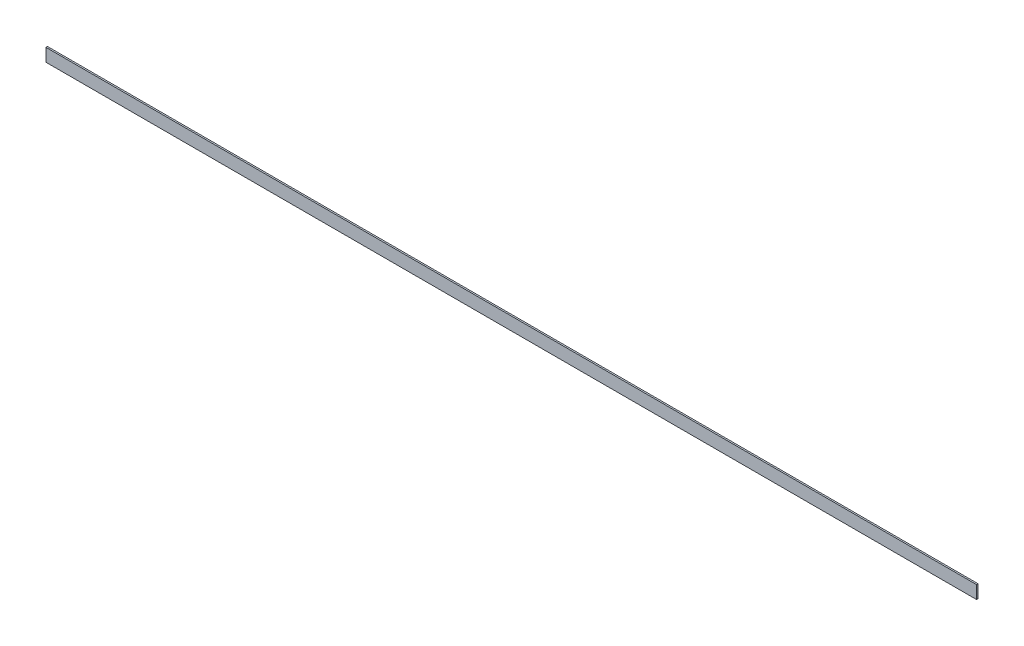
ISO-10303-21;
HEADER;
FILE_DESCRIPTION(('STEP AP214'),'2;1');
FILE_NAME('part.step','',(''),(''),'','','');
FILE_SCHEMA(('AUTOMOTIVE_DESIGN { 1 0 10303 214 1 1 1 1 }'));
ENDSEC;
DATA;
#1=APPLICATION_CONTEXT('core data for automotive mechanical design processes');
#2=APPLICATION_PROTOCOL_DEFINITION('international standard','automotive_design',2000,#1);
#3=PRODUCT_CONTEXT('',#1,'mechanical');
#4=PRODUCT('Part','Part','',(#3));
#5=PRODUCT_RELATED_PRODUCT_CATEGORY('part','',(#4));
#6=PRODUCT_DEFINITION_FORMATION('','',#4);
#7=PRODUCT_DEFINITION_CONTEXT('part definition',#1,'design');
#8=PRODUCT_DEFINITION('design','',#6,#7);
#9=PRODUCT_DEFINITION_SHAPE('','',#8);
#10=(LENGTH_UNIT() NAMED_UNIT(*) SI_UNIT(.MILLI.,.METRE.));
#11=(NAMED_UNIT(*) PLANE_ANGLE_UNIT() SI_UNIT($,.RADIAN.));
#12=(NAMED_UNIT(*) SI_UNIT($,.STERADIAN.) SOLID_ANGLE_UNIT());
#13=UNCERTAINTY_MEASURE_WITH_UNIT(LENGTH_MEASURE(1.E-05),#10,'distance_accuracy_value','');
#14=(GEOMETRIC_REPRESENTATION_CONTEXT(3) GLOBAL_UNCERTAINTY_ASSIGNED_CONTEXT((#13)) GLOBAL_UNIT_ASSIGNED_CONTEXT((#10,
#11,#12)) REPRESENTATION_CONTEXT('',''));
#15=CARTESIAN_POINT('',(0.,0.,0.));
#16=DIRECTION('',(0.,0.,1.));
#17=DIRECTION('',(1.,0.,0.));
#18=AXIS2_PLACEMENT_3D('',#15,#16,#17);
#19=CARTESIAN_POINT('',(-499.103870658318,236.482117486868,1.5875));
#20=DIRECTION('',(1.,0.,0.));
#21=DIRECTION('',(0.,1.,0.));
#22=AXIS2_PLACEMENT_3D('',#19,#20,#21);
#23=PLANE('',#22);
#24=DIRECTION('',(0.,-1.,0.));
#25=VECTOR('',#24,1.);
#26=CARTESIAN_POINT('',(-499.103870658318,236.482117486868,0.));
#27=LINE('',#26,#25);
#28=CARTESIAN_POINT('',(-499.103870658318,236.482117486868,0.));
#29=VERTEX_POINT('',#28);
#30=CARTESIAN_POINT('',(-499.103870658318,222.982117486868,0.));
#31=VERTEX_POINT('',#30);
#32=EDGE_CURVE('E107',#29,#31,#27,.T.);
#33=ORIENTED_EDGE('',*,*,#32,.T.);
#34=DIRECTION('',(0.,0.,-1.));
#35=VECTOR('',#34,1.);
#36=CARTESIAN_POINT('',(-499.103870658318,222.982117486868,1.5875));
#37=LINE('',#36,#35);
#38=CARTESIAN_POINT('',(-499.103870658318,222.982117486868,1.5875));
#39=VERTEX_POINT('',#38);
#40=EDGE_CURVE('E11',#39,#31,#37,.T.);
#41=ORIENTED_EDGE('',*,*,#40,.F.);
#42=DIRECTION('',(0.,-1.,0.));
#43=VECTOR('',#42,1.);
#44=CARTESIAN_POINT('',(-499.103870658318,236.482117486868,1.5875));
#45=LINE('',#44,#43);
#46=CARTESIAN_POINT('',(-499.103870658318,236.482117486868,1.5875));
#47=VERTEX_POINT('',#46);
#48=EDGE_CURVE('E91',#47,#39,#45,.T.);
#49=ORIENTED_EDGE('',*,*,#48,.F.);
#50=DIRECTION('',(0.,0.,-1.));
#51=VECTOR('',#50,1.);
#52=CARTESIAN_POINT('',(-499.103870658318,236.482117486868,1.5875));
#53=LINE('',#52,#51);
#54=EDGE_CURVE('E103',#47,#29,#53,.T.);
#55=ORIENTED_EDGE('',*,*,#54,.T.);
#56=EDGE_LOOP('',(#33,#41,#49,#55));
#57=FACE_BOUND('',#56,.T.);
#58=ADVANCED_FACE('F39',(#57),#23,.F.);
#59=CARTESIAN_POINT('',(-499.103870658318,222.982117486868,1.5875));
#60=DIRECTION('',(0.,1.,0.));
#61=DIRECTION('',(0.,0.,1.));
#62=AXIS2_PLACEMENT_3D('',#59,#60,#61);
#63=PLANE('',#62);
#64=DIRECTION('',(1.,0.,0.));
#65=VECTOR('',#64,1.);
#66=CARTESIAN_POINT('',(-499.103870658318,222.982117486868,0.));
#67=LINE('',#66,#65);
#68=CARTESIAN_POINT('',(471.948037991682,222.982117486868,0.));
#69=VERTEX_POINT('',#68);
#70=EDGE_CURVE('E96',#31,#69,#67,.T.);
#71=ORIENTED_EDGE('',*,*,#70,.T.);
#72=DIRECTION('',(0.,0.,-1.));
#73=VECTOR('',#72,1.);
#74=CARTESIAN_POINT('',(471.948037991682,222.982117486868,1.5875));
#75=LINE('',#74,#73);
#76=CARTESIAN_POINT('',(471.948037991682,222.982117486868,1.5875));
#77=VERTEX_POINT('',#76);
#78=EDGE_CURVE('E48',#77,#69,#75,.T.);
#79=ORIENTED_EDGE('',*,*,#78,.F.);
#80=DIRECTION('',(1.,0.,0.));
#81=VECTOR('',#80,1.);
#82=CARTESIAN_POINT('',(-499.103870658318,222.982117486868,1.5875));
#83=LINE('',#82,#81);
#84=EDGE_CURVE('E86',#39,#77,#83,.T.);
#85=ORIENTED_EDGE('',*,*,#84,.F.);
#86=ORIENTED_EDGE('',*,*,#40,.T.);
#87=EDGE_LOOP('',(#71,#79,#85,#86));
#88=FACE_BOUND('',#87,.T.);
#89=ADVANCED_FACE('F95',(#88),#63,.F.);
#90=CARTESIAN_POINT('',(471.948037991682,236.482117486868,1.5875));
#91=DIRECTION('',(-1.,0.,0.));
#92=DIRECTION('',(0.,0.,1.));
#93=AXIS2_PLACEMENT_3D('',#90,#91,#92);
#94=PLANE('',#93);
#95=DIRECTION('',(0.,1.,0.));
#96=VECTOR('',#95,1.);
#97=CARTESIAN_POINT('',(471.948037991682,236.482117486868,0.));
#98=LINE('',#97,#96);
#99=CARTESIAN_POINT('',(471.948037991682,236.482117486868,0.));
#100=VERTEX_POINT('',#99);
#101=EDGE_CURVE('E73',#69,#100,#98,.T.);
#102=ORIENTED_EDGE('',*,*,#101,.T.);
#103=DIRECTION('',(0.,0.,-1.));
#104=VECTOR('',#103,1.);
#105=CARTESIAN_POINT('',(471.948037991682,236.482117486868,1.5875));
#106=LINE('',#105,#104);
#107=CARTESIAN_POINT('',(471.948037991682,236.482117486868,1.5875));
#108=VERTEX_POINT('',#107);
#109=EDGE_CURVE('E98',#108,#100,#106,.T.);
#110=ORIENTED_EDGE('',*,*,#109,.F.);
#111=DIRECTION('',(0.,1.,0.));
#112=VECTOR('',#111,1.);
#113=CARTESIAN_POINT('',(471.948037991682,236.482117486868,1.5875));
#114=LINE('',#113,#112);
#115=EDGE_CURVE('E89',#77,#108,#114,.T.);
#116=ORIENTED_EDGE('',*,*,#115,.F.);
#117=ORIENTED_EDGE('',*,*,#78,.T.);
#118=EDGE_LOOP('',(#102,#110,#116,#117));
#119=FACE_BOUND('',#118,.T.);
#120=ADVANCED_FACE('F99',(#119),#94,.F.);
#121=CARTESIAN_POINT('',(-499.103870658318,236.482117486868,1.5875));
#122=DIRECTION('',(0.,-1.,0.));
#123=DIRECTION('',(0.,0.,-1.));
#124=AXIS2_PLACEMENT_3D('',#121,#122,#123);
#125=PLANE('',#124);
#126=DIRECTION('',(-1.,0.,0.));
#127=VECTOR('',#126,1.);
#128=CARTESIAN_POINT('',(-499.103870658318,236.482117486868,0.));
#129=LINE('',#128,#127);
#130=EDGE_CURVE('E79',#100,#29,#129,.T.);
#131=ORIENTED_EDGE('',*,*,#130,.T.);
#132=ORIENTED_EDGE('',*,*,#54,.F.);
#133=DIRECTION('',(-1.,0.,0.));
#134=VECTOR('',#133,1.);
#135=CARTESIAN_POINT('',(-499.103870658318,236.482117486868,1.5875));
#136=LINE('',#135,#134);
#137=EDGE_CURVE('E56',#108,#47,#136,.T.);
#138=ORIENTED_EDGE('',*,*,#137,.F.);
#139=ORIENTED_EDGE('',*,*,#109,.T.);
#140=EDGE_LOOP('',(#131,#132,#138,#139));
#141=FACE_BOUND('',#140,.T.);
#142=ADVANCED_FACE('F120',(#141),#125,.F.);
#143=CARTESIAN_POINT('',(0.,0.,1.5875));
#144=DIRECTION('',(0.,0.,1.));
#145=DIRECTION('',(1.,0.,0.));
#146=AXIS2_PLACEMENT_3D('',#143,#144,#145);
#147=PLANE('',#146);
#148=ORIENTED_EDGE('',*,*,#48,.T.);
#149=ORIENTED_EDGE('',*,*,#84,.T.);
#150=ORIENTED_EDGE('',*,*,#115,.T.);
#151=ORIENTED_EDGE('',*,*,#137,.T.);
#152=EDGE_LOOP('',(#148,#149,#150,#151));
#153=FACE_BOUND('',#152,.T.);
#154=ADVANCED_FACE('F87',(#153),#147,.T.);
#155=CARTESIAN_POINT('',(0.,0.,0.));
#156=DIRECTION('',(0.,0.,1.));
#157=DIRECTION('',(1.,0.,0.));
#158=AXIS2_PLACEMENT_3D('',#155,#156,#157);
#159=PLANE('',#158);
#160=ORIENTED_EDGE('',*,*,#32,.F.);
#161=ORIENTED_EDGE('',*,*,#130,.F.);
#162=ORIENTED_EDGE('',*,*,#101,.F.);
#163=ORIENTED_EDGE('',*,*,#70,.F.);
#164=EDGE_LOOP('',(#160,#161,#162,#163));
#165=FACE_BOUND('',#164,.T.);
#166=ADVANCED_FACE('F123',(#165),#159,.F.);
#167=CLOSED_SHELL('',(#58,#89,#120,#142,#154,#166));
#168=MANIFOLD_SOLID_BREP('B2',#167);
#169=ADVANCED_BREP_SHAPE_REPRESENTATION('',(#18,#168),#14);
#170=SHAPE_DEFINITION_REPRESENTATION(#9,#169);
ENDSEC;
END-ISO-10303-21;
